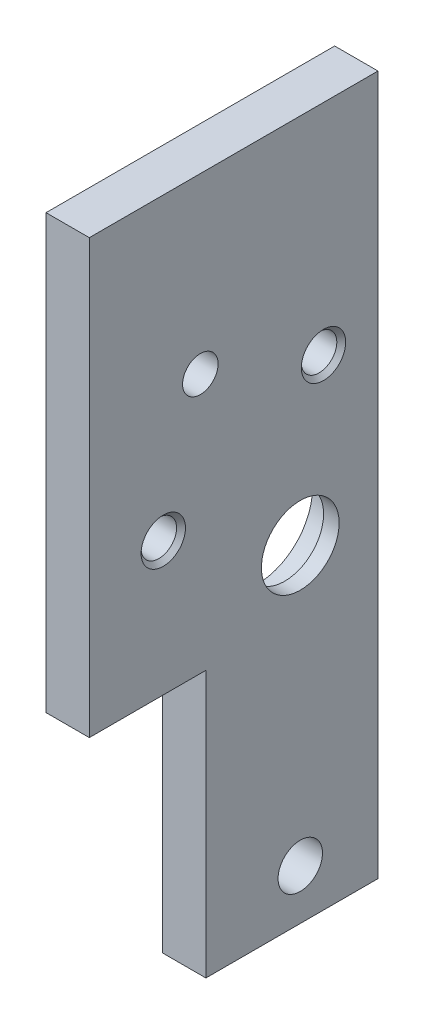
ISO-10303-21;
HEADER;
FILE_DESCRIPTION(('STEP AP214'),'2;1');
FILE_NAME('part.step','',(''),(''),'','','');
FILE_SCHEMA(('AUTOMOTIVE_DESIGN { 1 0 10303 214 1 1 1 1 }'));
ENDSEC;
DATA;
#1=APPLICATION_CONTEXT('core data for automotive mechanical design processes');
#2=APPLICATION_PROTOCOL_DEFINITION('international standard','automotive_design',2000,#1);
#3=PRODUCT_CONTEXT('',#1,'mechanical');
#4=PRODUCT('Part','Part','',(#3));
#5=PRODUCT_RELATED_PRODUCT_CATEGORY('part','',(#4));
#6=PRODUCT_DEFINITION_FORMATION('','',#4);
#7=PRODUCT_DEFINITION_CONTEXT('part definition',#1,'design');
#8=PRODUCT_DEFINITION('design','',#6,#7);
#9=PRODUCT_DEFINITION_SHAPE('','',#8);
#10=(LENGTH_UNIT() NAMED_UNIT(*) SI_UNIT(.MILLI.,.METRE.));
#11=(NAMED_UNIT(*) PLANE_ANGLE_UNIT() SI_UNIT($,.RADIAN.));
#12=(NAMED_UNIT(*) SI_UNIT($,.STERADIAN.) SOLID_ANGLE_UNIT());
#13=UNCERTAINTY_MEASURE_WITH_UNIT(LENGTH_MEASURE(1.E-05),#10,'distance_accuracy_value','');
#14=(GEOMETRIC_REPRESENTATION_CONTEXT(3) GLOBAL_UNCERTAINTY_ASSIGNED_CONTEXT((#13)) GLOBAL_UNIT_ASSIGNED_CONTEXT((#10,
#11,#12)) REPRESENTATION_CONTEXT('',''));
#15=CARTESIAN_POINT('',(0.,0.,0.));
#16=DIRECTION('',(0.,0.,1.));
#17=DIRECTION('',(1.,0.,0.));
#18=AXIS2_PLACEMENT_3D('',#15,#16,#17);
#19=CARTESIAN_POINT('',(-3.9,29.5,7.));
#20=DIRECTION('',(1.,0.,0.));
#21=DIRECTION('',(0.,0.,-1.));
#22=AXIS2_PLACEMENT_3D('',#19,#20,#21);
#23=CYLINDRICAL_SURFACE('',#22,5.);
#24=CARTESIAN_POINT('',(-3.9,29.5,7.));
#25=DIRECTION('',(1.,0.,0.));
#26=DIRECTION('',(0.,0.,-1.));
#27=AXIS2_PLACEMENT_3D('',#24,#25,#26);
#28=CIRCLE('',#27,5.);
#29=CARTESIAN_POINT('',(-3.9,29.5,2.));
#30=VERTEX_POINT('',#29);
#31=EDGE_CURVE('E124',#30,#30,#28,.T.);
#32=ORIENTED_EDGE('',*,*,#31,.F.);
#33=EDGE_LOOP('',(#32));
#34=FACE_BOUND('',#33,.T.);
#35=CARTESIAN_POINT('',(-1.4,29.5,7.));
#36=DIRECTION('',(1.,0.,0.));
#37=DIRECTION('',(0.,0.,-1.));
#38=AXIS2_PLACEMENT_3D('',#35,#36,#37);
#39=CIRCLE('',#38,5.);
#40=CARTESIAN_POINT('',(-1.4,29.5,2.));
#41=VERTEX_POINT('',#40);
#42=EDGE_CURVE('E13',#41,#41,#39,.F.);
#43=ORIENTED_EDGE('',*,*,#42,.F.);
#44=EDGE_LOOP('',(#43));
#45=FACE_BOUND('',#44,.T.);
#46=ADVANCED_FACE('F45',(#34,#45),#23,.F.);
#47=CARTESIAN_POINT('',(-3.9,0.,0.));
#48=DIRECTION('',(0.,0.,-1.));
#49=DIRECTION('',(0.,1.,0.));
#50=AXIS2_PLACEMENT_3D('',#47,#48,#49);
#51=PLANE('',#50);
#52=DIRECTION('',(0.,1.,0.));
#53=VECTOR('',#52,1.);
#54=CARTESIAN_POINT('',(0.,0.,0.));
#55=LINE('',#54,#53);
#56=CARTESIAN_POINT('',(0.,0.,0.));
#57=VERTEX_POINT('',#56);
#58=CARTESIAN_POINT('',(0.,63.,0.));
#59=VERTEX_POINT('',#58);
#60=EDGE_CURVE('E119',#57,#59,#55,.T.);
#61=ORIENTED_EDGE('',*,*,#60,.F.);
#62=DIRECTION('',(1.,0.,0.));
#63=VECTOR('',#62,1.);
#64=CARTESIAN_POINT('',(-3.9,0.,0.));
#65=LINE('',#64,#63);
#66=CARTESIAN_POINT('',(-3.9,0.,0.));
#67=VERTEX_POINT('',#66);
#68=EDGE_CURVE('E53',#67,#57,#65,.T.);
#69=ORIENTED_EDGE('',*,*,#68,.F.);
#70=DIRECTION('',(0.,1.,0.));
#71=VECTOR('',#70,1.);
#72=CARTESIAN_POINT('',(-3.9,0.,0.));
#73=LINE('',#72,#71);
#74=CARTESIAN_POINT('',(-3.9,63.,0.));
#75=VERTEX_POINT('',#74);
#76=EDGE_CURVE('E122',#67,#75,#73,.T.);
#77=ORIENTED_EDGE('',*,*,#76,.T.);
#78=DIRECTION('',(1.,0.,0.));
#79=VECTOR('',#78,1.);
#80=CARTESIAN_POINT('',(-3.9,63.,0.));
#81=LINE('',#80,#79);
#82=EDGE_CURVE('E129',#75,#59,#81,.T.);
#83=ORIENTED_EDGE('',*,*,#82,.T.);
#84=EDGE_LOOP('',(#61,#69,#77,#83));
#85=FACE_BOUND('',#84,.T.);
#86=ADVANCED_FACE('F47',(#85),#51,.T.);
#87=CARTESIAN_POINT('',(-3.9,0.,0.));
#88=DIRECTION('',(0.,-1.,0.));
#89=DIRECTION('',(0.,0.,-1.));
#90=AXIS2_PLACEMENT_3D('',#87,#88,#89);
#91=PLANE('',#90);
#92=DIRECTION('',(1.,0.,0.));
#93=VECTOR('',#92,1.);
#94=CARTESIAN_POINT('',(-3.9,0.,15.5));
#95=LINE('',#94,#93);
#96=CARTESIAN_POINT('',(-3.9,0.,15.5));
#97=VERTEX_POINT('',#96);
#98=CARTESIAN_POINT('',(0.,0.,15.5));
#99=VERTEX_POINT('',#98);
#100=EDGE_CURVE('E68',#97,#99,#95,.T.);
#101=ORIENTED_EDGE('',*,*,#100,.F.);
#102=DIRECTION('',(0.,0.,-1.));
#103=VECTOR('',#102,1.);
#104=CARTESIAN_POINT('',(-3.9,0.,0.));
#105=LINE('',#104,#103);
#106=EDGE_CURVE('E130',#97,#67,#105,.T.);
#107=ORIENTED_EDGE('',*,*,#106,.T.);
#108=ORIENTED_EDGE('',*,*,#68,.T.);
#109=DIRECTION('',(0.,0.,-1.));
#110=VECTOR('',#109,1.);
#111=CARTESIAN_POINT('',(0.,0.,0.));
#112=LINE('',#111,#110);
#113=EDGE_CURVE('E120',#99,#57,#112,.T.);
#114=ORIENTED_EDGE('',*,*,#113,.F.);
#115=EDGE_LOOP('',(#101,#107,#108,#114));
#116=FACE_BOUND('',#115,.T.);
#117=ADVANCED_FACE('F231',(#116),#91,.T.);
#118=CARTESIAN_POINT('',(-3.9,63.,0.));
#119=DIRECTION('',(0.,1.,0.));
#120=DIRECTION('',(0.,0.,1.));
#121=AXIS2_PLACEMENT_3D('',#118,#119,#120);
#122=PLANE('',#121);
#123=DIRECTION('',(-1.,0.,0.));
#124=VECTOR('',#123,1.);
#125=CARTESIAN_POINT('',(0.,63.,26.));
#126=LINE('',#125,#124);
#127=CARTESIAN_POINT('',(0.,63.,26.));
#128=VERTEX_POINT('',#127);
#129=CARTESIAN_POINT('',(-3.9,63.,26.));
#130=VERTEX_POINT('',#129);
#131=EDGE_CURVE('E100',#128,#130,#126,.T.);
#132=ORIENTED_EDGE('',*,*,#131,.F.);
#133=DIRECTION('',(0.,0.,1.));
#134=VECTOR('',#133,1.);
#135=CARTESIAN_POINT('',(0.,63.,0.));
#136=LINE('',#135,#134);
#137=EDGE_CURVE('E111',#59,#128,#136,.T.);
#138=ORIENTED_EDGE('',*,*,#137,.F.);
#139=ORIENTED_EDGE('',*,*,#82,.F.);
#140=DIRECTION('',(0.,0.,1.));
#141=VECTOR('',#140,1.);
#142=CARTESIAN_POINT('',(-3.9,63.,0.));
#143=LINE('',#142,#141);
#144=EDGE_CURVE('E114',#75,#130,#143,.T.);
#145=ORIENTED_EDGE('',*,*,#144,.T.);
#146=EDGE_LOOP('',(#132,#138,#139,#145));
#147=FACE_BOUND('',#146,.T.);
#148=ADVANCED_FACE('F110',(#147),#122,.T.);
#149=CARTESIAN_POINT('',(-3.9,0.,0.));
#150=DIRECTION('',(1.,0.,0.));
#151=DIRECTION('',(0.,0.,-1.));
#152=AXIS2_PLACEMENT_3D('',#149,#150,#151);
#153=PLANE('',#152);
#154=CARTESIAN_POINT('',(-3.9,36.0326086873371,19.3396657899873));
#155=DIRECTION('',(1.,0.,0.));
#156=DIRECTION('',(0.,0.,-1.));
#157=AXIS2_PLACEMENT_3D('',#154,#155,#156);
#158=CIRCLE('',#157,1.6);
#159=CARTESIAN_POINT('',(-3.9,36.0326086873371,17.7396657899873));
#160=VERTEX_POINT('',#159);
#161=EDGE_CURVE('E181',#160,#160,#158,.T.);
#162=ORIENTED_EDGE('',*,*,#161,.T.);
#163=EDGE_LOOP('',(#162));
#164=FACE_BOUND('',#163,.T.);
#165=CARTESIAN_POINT('',(-3.9,43.3046086873371,4.90832434159794));
#166=DIRECTION('',(1.,0.,0.));
#167=DIRECTION('',(0.,0.,-1.));
#168=AXIS2_PLACEMENT_3D('',#165,#166,#167);
#169=CIRCLE('',#168,1.6);
#170=CARTESIAN_POINT('',(-3.9,43.3046086873371,3.30832434159795));
#171=VERTEX_POINT('',#170);
#172=EDGE_CURVE('E172',#171,#171,#169,.T.);
#173=ORIENTED_EDGE('',*,*,#172,.T.);
#174=EDGE_LOOP('',(#173));
#175=FACE_BOUND('',#174,.T.);
#176=CARTESIAN_POINT('',(-3.9,47.3605710994917,16.));
#177=DIRECTION('',(-1.,0.,0.));
#178=DIRECTION('',(0.,0.,1.));
#179=AXIS2_PLACEMENT_3D('',#176,#177,#178);
#180=CIRCLE('',#179,4.5);
#181=CARTESIAN_POINT('',(-3.9,47.3605710994917,20.5));
#182=VERTEX_POINT('',#181);
#183=EDGE_CURVE('E169',#182,#182,#180,.T.);
#184=ORIENTED_EDGE('',*,*,#183,.F.);
#185=EDGE_LOOP('',(#184));
#186=FACE_BOUND('',#185,.T.);
#187=CARTESIAN_POINT('',(-3.9,4.5,7.));
#188=DIRECTION('',(1.,0.,0.));
#189=DIRECTION('',(0.,0.,-1.));
#190=AXIS2_PLACEMENT_3D('',#187,#188,#189);
#191=CIRCLE('',#190,2.);
#192=CARTESIAN_POINT('',(-3.9,4.5,5.));
#193=VERTEX_POINT('',#192);
#194=EDGE_CURVE('E141',#193,#193,#191,.T.);
#195=ORIENTED_EDGE('',*,*,#194,.T.);
#196=EDGE_LOOP('',(#195));
#197=FACE_BOUND('',#196,.T.);
#198=ORIENTED_EDGE('',*,*,#31,.T.);
#199=EDGE_LOOP('',(#198));
#200=FACE_BOUND('',#199,.T.);
#201=DIRECTION('',(0.,0.,1.));
#202=VECTOR('',#201,1.);
#203=CARTESIAN_POINT('',(-3.9,24.,30.));
#204=LINE('',#203,#202);
#205=CARTESIAN_POINT('',(-3.9,24.,15.5));
#206=VERTEX_POINT('',#205);
#207=CARTESIAN_POINT('',(-3.9,24.,26.));
#208=VERTEX_POINT('',#207);
#209=EDGE_CURVE('E149',#206,#208,#204,.T.);
#210=ORIENTED_EDGE('',*,*,#209,.T.);
#211=DIRECTION('',(0.,-1.,0.));
#212=VECTOR('',#211,1.);
#213=CARTESIAN_POINT('',(-3.9,24.,26.));
#214=LINE('',#213,#212);
#215=EDGE_CURVE('E60',#130,#208,#214,.T.);
#216=ORIENTED_EDGE('',*,*,#215,.F.);
#217=ORIENTED_EDGE('',*,*,#144,.F.);
#218=ORIENTED_EDGE('',*,*,#76,.F.);
#219=ORIENTED_EDGE('',*,*,#106,.F.);
#220=DIRECTION('',(0.,1.,0.));
#221=VECTOR('',#220,1.);
#222=CARTESIAN_POINT('',(-3.9,0.,15.5));
#223=LINE('',#222,#221);
#224=EDGE_CURVE('E153',#97,#206,#223,.T.);
#225=ORIENTED_EDGE('',*,*,#224,.T.);
#226=EDGE_LOOP('',(#210,#216,#217,#218,#219,#225));
#227=FACE_BOUND('',#226,.T.);
#228=ADVANCED_FACE('F210',(#164,#175,#186,#197,#200,#227),#153,.F.);
#229=CARTESIAN_POINT('',(0.,0.,0.));
#230=DIRECTION('',(1.,0.,0.));
#231=DIRECTION('',(0.,0.,-1.));
#232=AXIS2_PLACEMENT_3D('',#229,#230,#231);
#233=PLANE('',#232);
#234=DIRECTION('',(0.,-1.,0.));
#235=VECTOR('',#234,1.);
#236=CARTESIAN_POINT('',(0.,24.,26.));
#237=LINE('',#236,#235);
#238=CARTESIAN_POINT('',(0.,24.,26.));
#239=VERTEX_POINT('',#238);
#240=EDGE_CURVE('E97',#128,#239,#237,.T.);
#241=ORIENTED_EDGE('',*,*,#240,.T.);
#242=DIRECTION('',(0.,0.,1.));
#243=VECTOR('',#242,1.);
#244=CARTESIAN_POINT('',(0.,24.,30.));
#245=LINE('',#244,#243);
#246=CARTESIAN_POINT('',(0.,24.,15.5));
#247=VERTEX_POINT('',#246);
#248=EDGE_CURVE('E151',#247,#239,#245,.T.);
#249=ORIENTED_EDGE('',*,*,#248,.F.);
#250=DIRECTION('',(0.,1.,0.));
#251=VECTOR('',#250,1.);
#252=CARTESIAN_POINT('',(0.,0.,15.5));
#253=LINE('',#252,#251);
#254=EDGE_CURVE('E154',#99,#247,#253,.T.);
#255=ORIENTED_EDGE('',*,*,#254,.F.);
#256=ORIENTED_EDGE('',*,*,#113,.T.);
#257=ORIENTED_EDGE('',*,*,#60,.T.);
#258=ORIENTED_EDGE('',*,*,#137,.T.);
#259=EDGE_LOOP('',(#241,#249,#255,#256,#257,#258));
#260=FACE_BOUND('',#259,.T.);
#261=CARTESIAN_POINT('',(0.,36.0326086873371,19.3396657899873));
#262=DIRECTION('',(1.,0.,0.));
#263=DIRECTION('',(0.,0.,-1.));
#264=AXIS2_PLACEMENT_3D('',#261,#262,#263);
#265=CIRCLE('',#264,2.);
#266=CARTESIAN_POINT('',(0.,36.0326086873371,17.3396657899873));
#267=VERTEX_POINT('',#266);
#268=EDGE_CURVE('E187',#267,#267,#265,.T.);
#269=ORIENTED_EDGE('',*,*,#268,.F.);
#270=EDGE_LOOP('',(#269));
#271=FACE_BOUND('',#270,.T.);
#272=CARTESIAN_POINT('',(0.,43.3046086873371,4.90832434159794));
#273=DIRECTION('',(1.,0.,0.));
#274=DIRECTION('',(0.,0.,-1.));
#275=AXIS2_PLACEMENT_3D('',#272,#273,#274);
#276=CIRCLE('',#275,2.);
#277=CARTESIAN_POINT('',(0.,43.3046086873371,2.90832434159794));
#278=VERTEX_POINT('',#277);
#279=EDGE_CURVE('E178',#278,#278,#276,.T.);
#280=ORIENTED_EDGE('',*,*,#279,.F.);
#281=EDGE_LOOP('',(#280));
#282=FACE_BOUND('',#281,.T.);
#283=CARTESIAN_POINT('',(0.,47.3605710994917,16.));
#284=DIRECTION('',(-1.,0.,0.));
#285=DIRECTION('',(0.,0.,1.));
#286=AXIS2_PLACEMENT_3D('',#283,#284,#285);
#287=CIRCLE('',#286,1.6);
#288=CARTESIAN_POINT('',(0.,47.3605710994917,17.6));
#289=VERTEX_POINT('',#288);
#290=EDGE_CURVE('E156',#289,#289,#287,.T.);
#291=ORIENTED_EDGE('',*,*,#290,.T.);
#292=EDGE_LOOP('',(#291));
#293=FACE_BOUND('',#292,.T.);
#294=CARTESIAN_POINT('',(0.,4.5,7.));
#295=DIRECTION('',(1.,0.,0.));
#296=DIRECTION('',(0.,0.,-1.));
#297=AXIS2_PLACEMENT_3D('',#294,#295,#296);
#298=CIRCLE('',#297,2.);
#299=CARTESIAN_POINT('',(0.,4.5,5.));
#300=VERTEX_POINT('',#299);
#301=EDGE_CURVE('E144',#300,#300,#298,.T.);
#302=ORIENTED_EDGE('',*,*,#301,.F.);
#303=EDGE_LOOP('',(#302));
#304=FACE_BOUND('',#303,.T.);
#305=CARTESIAN_POINT('',(0.,29.5,7.));
#306=DIRECTION('',(1.,0.,0.));
#307=DIRECTION('',(0.,0.,-1.));
#308=AXIS2_PLACEMENT_3D('',#305,#306,#307);
#309=CIRCLE('',#308,3.5);
#310=CARTESIAN_POINT('',(0.,29.5,3.5));
#311=VERTEX_POINT('',#310);
#312=EDGE_CURVE('E193',#311,#311,#309,.T.);
#313=ORIENTED_EDGE('',*,*,#312,.F.);
#314=EDGE_LOOP('',(#313));
#315=FACE_BOUND('',#314,.T.);
#316=ADVANCED_FACE('F116',(#260,#271,#282,#293,#304,#315),#233,.T.);
#317=CARTESIAN_POINT('',(0.,4.5,7.));
#318=DIRECTION('',(1.,0.,0.));
#319=DIRECTION('',(0.,0.,-1.));
#320=AXIS2_PLACEMENT_3D('',#317,#318,#319);
#321=CYLINDRICAL_SURFACE('',#320,2.);
#322=ORIENTED_EDGE('',*,*,#194,.F.);
#323=EDGE_LOOP('',(#322));
#324=FACE_BOUND('',#323,.T.);
#325=ORIENTED_EDGE('',*,*,#301,.T.);
#326=EDGE_LOOP('',(#325));
#327=FACE_BOUND('',#326,.T.);
#328=ADVANCED_FACE('F209',(#324,#327),#321,.F.);
#329=CARTESIAN_POINT('',(-3.9,24.,30.));
#330=DIRECTION('',(0.,1.,0.));
#331=DIRECTION('',(0.,0.,1.));
#332=AXIS2_PLACEMENT_3D('',#329,#330,#331);
#333=PLANE('',#332);
#334=ORIENTED_EDGE('',*,*,#248,.T.);
#335=DIRECTION('',(-1.,0.,0.));
#336=VECTOR('',#335,1.);
#337=CARTESIAN_POINT('',(0.,24.,26.));
#338=LINE('',#337,#336);
#339=EDGE_CURVE('E101',#239,#208,#338,.T.);
#340=ORIENTED_EDGE('',*,*,#339,.T.);
#341=ORIENTED_EDGE('',*,*,#209,.F.);
#342=DIRECTION('',(1.,0.,0.));
#343=VECTOR('',#342,1.);
#344=CARTESIAN_POINT('',(-3.9,24.,15.5));
#345=LINE('',#344,#343);
#346=EDGE_CURVE('E147',#206,#247,#345,.T.);
#347=ORIENTED_EDGE('',*,*,#346,.T.);
#348=EDGE_LOOP('',(#334,#340,#341,#347));
#349=FACE_BOUND('',#348,.T.);
#350=ADVANCED_FACE('F217',(#349),#333,.F.);
#351=CARTESIAN_POINT('',(-3.9,0.,15.5));
#352=DIRECTION('',(0.,0.,-1.));
#353=DIRECTION('',(-1.,0.,0.));
#354=AXIS2_PLACEMENT_3D('',#351,#352,#353);
#355=PLANE('',#354);
#356=ORIENTED_EDGE('',*,*,#254,.T.);
#357=ORIENTED_EDGE('',*,*,#346,.F.);
#358=ORIENTED_EDGE('',*,*,#224,.F.);
#359=ORIENTED_EDGE('',*,*,#100,.T.);
#360=EDGE_LOOP('',(#356,#357,#358,#359));
#361=FACE_BOUND('',#360,.T.);
#362=ADVANCED_FACE('F235',(#361),#355,.F.);
#363=CARTESIAN_POINT('',(-3.9,47.3605710994917,16.));
#364=DIRECTION('',(-1.,0.,0.));
#365=DIRECTION('',(0.,0.,1.));
#366=AXIS2_PLACEMENT_3D('',#363,#364,#365);
#367=CYLINDRICAL_SURFACE('',#366,1.6);
#368=ORIENTED_EDGE('',*,*,#290,.F.);
#369=EDGE_LOOP('',(#368));
#370=FACE_BOUND('',#369,.T.);
#371=CARTESIAN_POINT('',(-2.9,47.3605710994917,16.));
#372=DIRECTION('',(-1.,0.,0.));
#373=DIRECTION('',(0.,0.,1.));
#374=AXIS2_PLACEMENT_3D('',#371,#372,#373);
#375=CIRCLE('',#374,1.6);
#376=CARTESIAN_POINT('',(-2.9,47.3605710994917,17.6));
#377=VERTEX_POINT('',#376);
#378=EDGE_CURVE('E163',#377,#377,#375,.T.);
#379=ORIENTED_EDGE('',*,*,#378,.T.);
#380=EDGE_LOOP('',(#379));
#381=FACE_BOUND('',#380,.T.);
#382=ADVANCED_FACE('F238',(#370,#381),#367,.F.);
#383=CARTESIAN_POINT('',(-2.9,48.9605710994917,16.));
#384=DIRECTION('',(1.,0.,0.));
#385=DIRECTION('',(0.,0.,-1.));
#386=AXIS2_PLACEMENT_3D('',#383,#384,#385);
#387=PLANE('',#386);
#388=ORIENTED_EDGE('',*,*,#378,.F.);
#389=EDGE_LOOP('',(#388));
#390=FACE_BOUND('',#389,.T.);
#391=CARTESIAN_POINT('',(-2.9,47.3605710994917,16.));
#392=DIRECTION('',(-1.,0.,0.));
#393=DIRECTION('',(0.,0.,1.));
#394=AXIS2_PLACEMENT_3D('',#391,#392,#393);
#395=CIRCLE('',#394,4.5);
#396=CARTESIAN_POINT('',(-2.9,47.3605710994917,20.5));
#397=VERTEX_POINT('',#396);
#398=EDGE_CURVE('E166',#397,#397,#395,.T.);
#399=ORIENTED_EDGE('',*,*,#398,.T.);
#400=EDGE_LOOP('',(#399));
#401=FACE_BOUND('',#400,.T.);
#402=ADVANCED_FACE('F244',(#390,#401),#387,.F.);
#403=CARTESIAN_POINT('',(-3.9,47.3605710994917,16.));
#404=DIRECTION('',(-1.,0.,0.));
#405=DIRECTION('',(0.,0.,1.));
#406=AXIS2_PLACEMENT_3D('',#403,#404,#405);
#407=CYLINDRICAL_SURFACE('',#406,4.5);
#408=ORIENTED_EDGE('',*,*,#398,.F.);
#409=EDGE_LOOP('',(#408));
#410=FACE_BOUND('',#409,.T.);
#411=ORIENTED_EDGE('',*,*,#183,.T.);
#412=EDGE_LOOP('',(#411));
#413=FACE_BOUND('',#412,.T.);
#414=ADVANCED_FACE('F248',(#410,#413),#407,.F.);
#415=CARTESIAN_POINT('',(0.,43.3046086873371,4.90832434159794));
#416=DIRECTION('',(1.,0.,0.));
#417=DIRECTION('',(0.,0.,-1.));
#418=AXIS2_PLACEMENT_3D('',#415,#416,#417);
#419=CYLINDRICAL_SURFACE('',#418,1.6);
#420=ORIENTED_EDGE('',*,*,#172,.F.);
#421=EDGE_LOOP('',(#420));
#422=FACE_BOUND('',#421,.T.);
#423=CARTESIAN_POINT('',(-0.4,43.3046086873371,4.90832434159794));
#424=DIRECTION('',(1.,0.,0.));
#425=DIRECTION('',(0.,0.,-1.));
#426=AXIS2_PLACEMENT_3D('',#423,#424,#425);
#427=CIRCLE('',#426,1.6);
#428=CARTESIAN_POINT('',(-0.4,43.3046086873371,3.30832434159795));
#429=VERTEX_POINT('',#428);
#430=EDGE_CURVE('E175',#429,#429,#427,.T.);
#431=ORIENTED_EDGE('',*,*,#430,.T.);
#432=EDGE_LOOP('',(#431));
#433=FACE_BOUND('',#432,.T.);
#434=ADVANCED_FACE('F252',(#422,#433),#419,.F.);
#435=CARTESIAN_POINT('',(0.,43.3046086873371,4.90832434159794));
#436=DIRECTION('',(1.,0.,0.));
#437=DIRECTION('',(0.,0.,-1.));
#438=AXIS2_PLACEMENT_3D('',#435,#436,#437);
#439=CONICAL_SURFACE('',#438,2.,0.785398163397454);
#440=ORIENTED_EDGE('',*,*,#430,.F.);
#441=EDGE_LOOP('',(#440));
#442=FACE_BOUND('',#441,.T.);
#443=ORIENTED_EDGE('',*,*,#279,.T.);
#444=EDGE_LOOP('',(#443));
#445=FACE_BOUND('',#444,.T.);
#446=ADVANCED_FACE('F256',(#442,#445),#439,.F.);
#447=CARTESIAN_POINT('',(0.,36.0326086873371,19.3396657899873));
#448=DIRECTION('',(1.,0.,0.));
#449=DIRECTION('',(0.,0.,-1.));
#450=AXIS2_PLACEMENT_3D('',#447,#448,#449);
#451=CYLINDRICAL_SURFACE('',#450,1.6);
#452=ORIENTED_EDGE('',*,*,#161,.F.);
#453=EDGE_LOOP('',(#452));
#454=FACE_BOUND('',#453,.T.);
#455=CARTESIAN_POINT('',(-0.4,36.0326086873371,19.3396657899873));
#456=DIRECTION('',(1.,0.,0.));
#457=DIRECTION('',(0.,0.,-1.));
#458=AXIS2_PLACEMENT_3D('',#455,#456,#457);
#459=CIRCLE('',#458,1.6);
#460=CARTESIAN_POINT('',(-0.4,36.0326086873371,17.7396657899873));
#461=VERTEX_POINT('',#460);
#462=EDGE_CURVE('E184',#461,#461,#459,.T.);
#463=ORIENTED_EDGE('',*,*,#462,.T.);
#464=EDGE_LOOP('',(#463));
#465=FACE_BOUND('',#464,.T.);
#466=ADVANCED_FACE('F260',(#454,#465),#451,.F.);
#467=CARTESIAN_POINT('',(0.,36.0326086873371,19.3396657899873));
#468=DIRECTION('',(1.,0.,0.));
#469=DIRECTION('',(0.,0.,-1.));
#470=AXIS2_PLACEMENT_3D('',#467,#468,#469);
#471=CONICAL_SURFACE('',#470,2.,0.785398163397454);
#472=ORIENTED_EDGE('',*,*,#462,.F.);
#473=EDGE_LOOP('',(#472));
#474=FACE_BOUND('',#473,.T.);
#475=ORIENTED_EDGE('',*,*,#268,.T.);
#476=EDGE_LOOP('',(#475));
#477=FACE_BOUND('',#476,.T.);
#478=ADVANCED_FACE('F264',(#474,#477),#471,.F.);
#479=CARTESIAN_POINT('',(0.,24.,26.));
#480=DIRECTION('',(0.,0.,-1.));
#481=DIRECTION('',(-1.,0.,0.));
#482=AXIS2_PLACEMENT_3D('',#479,#480,#481);
#483=PLANE('',#482);
#484=ORIENTED_EDGE('',*,*,#215,.T.);
#485=ORIENTED_EDGE('',*,*,#339,.F.);
#486=ORIENTED_EDGE('',*,*,#240,.F.);
#487=ORIENTED_EDGE('',*,*,#131,.T.);
#488=EDGE_LOOP('',(#484,#485,#486,#487));
#489=FACE_BOUND('',#488,.T.);
#490=ADVANCED_FACE('F99',(#489),#483,.F.);
#491=CARTESIAN_POINT('',(-1.4,29.5,7.));
#492=DIRECTION('',(1.,0.,0.));
#493=DIRECTION('',(0.,0.,-1.));
#494=AXIS2_PLACEMENT_3D('',#491,#492,#493);
#495=PLANE('',#494);
#496=CARTESIAN_POINT('',(-1.4,29.5,7.));
#497=DIRECTION('',(1.,0.,0.));
#498=DIRECTION('',(0.,0.,-1.));
#499=AXIS2_PLACEMENT_3D('',#496,#497,#498);
#500=CIRCLE('',#499,3.5);
#501=CARTESIAN_POINT('',(-1.4,29.5,3.5));
#502=VERTEX_POINT('',#501);
#503=EDGE_CURVE('E191',#502,#502,#500,.T.);
#504=ORIENTED_EDGE('',*,*,#503,.T.);
#505=EDGE_LOOP('',(#504));
#506=FACE_BOUND('',#505,.T.);
#507=ORIENTED_EDGE('',*,*,#42,.T.);
#508=EDGE_LOOP('',(#507));
#509=FACE_BOUND('',#508,.T.);
#510=ADVANCED_FACE('F199',(#506,#509),#495,.F.);
#511=CARTESIAN_POINT('',(-1.4,29.5,7.));
#512=DIRECTION('',(1.,0.,0.));
#513=DIRECTION('',(0.,0.,-1.));
#514=AXIS2_PLACEMENT_3D('',#511,#512,#513);
#515=CYLINDRICAL_SURFACE('',#514,3.5);
#516=ORIENTED_EDGE('',*,*,#503,.F.);
#517=EDGE_LOOP('',(#516));
#518=FACE_BOUND('',#517,.T.);
#519=ORIENTED_EDGE('',*,*,#312,.T.);
#520=EDGE_LOOP('',(#519));
#521=FACE_BOUND('',#520,.T.);
#522=ADVANCED_FACE('F202',(#518,#521),#515,.F.);
#523=CLOSED_SHELL('',(#46,#86,#117,#148,#228,#316,#328,#350,#362,#382,#402,#414,#434,#446,#466,
#478,#490,#510,#522));
#524=MANIFOLD_SOLID_BREP('B2',#523);
#525=ADVANCED_BREP_SHAPE_REPRESENTATION('',(#18,#524),#14);
#526=SHAPE_DEFINITION_REPRESENTATION(#9,#525);
ENDSEC;
END-ISO-10303-21;
